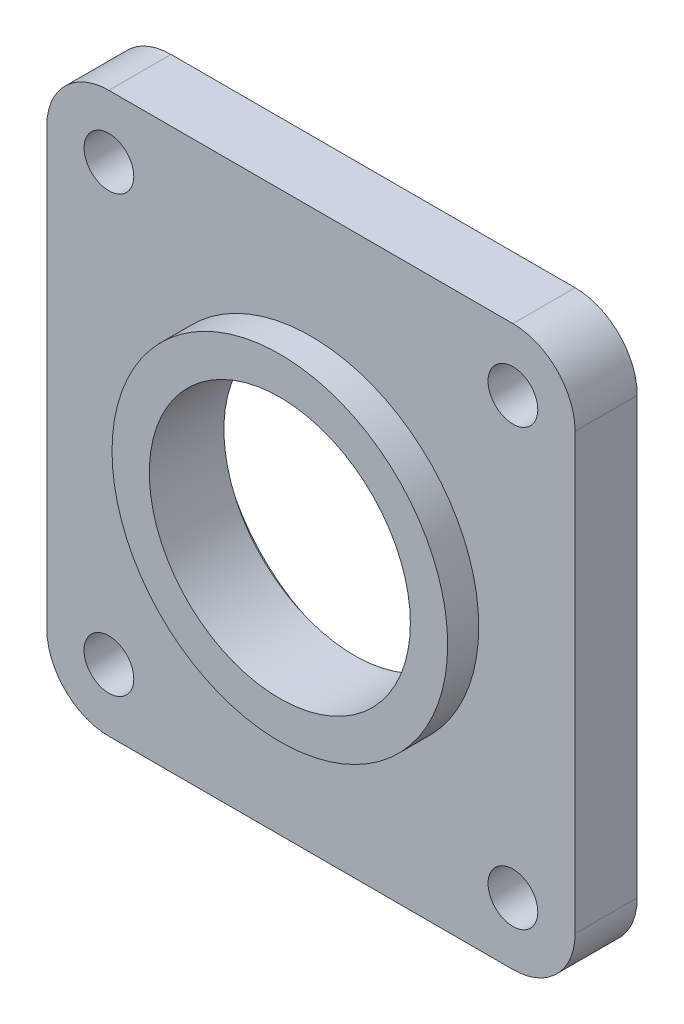
ISO-10303-21;
HEADER;
FILE_DESCRIPTION(('STEP AP214'),'2;1');
FILE_NAME('part.step','',(''),(''),'','','');
FILE_SCHEMA(('AUTOMOTIVE_DESIGN { 1 0 10303 214 1 1 1 1 }'));
ENDSEC;
DATA;
#1=APPLICATION_CONTEXT('core data for automotive mechanical design processes');
#2=APPLICATION_PROTOCOL_DEFINITION('international standard','automotive_design',2000,#1);
#3=PRODUCT_CONTEXT('',#1,'mechanical');
#4=PRODUCT('Part','Part','',(#3));
#5=PRODUCT_RELATED_PRODUCT_CATEGORY('part','',(#4));
#6=PRODUCT_DEFINITION_FORMATION('','',#4);
#7=PRODUCT_DEFINITION_CONTEXT('part definition',#1,'design');
#8=PRODUCT_DEFINITION('design','',#6,#7);
#9=PRODUCT_DEFINITION_SHAPE('','',#8);
#10=(LENGTH_UNIT() NAMED_UNIT(*) SI_UNIT(.MILLI.,.METRE.));
#11=(NAMED_UNIT(*) PLANE_ANGLE_UNIT() SI_UNIT($,.RADIAN.));
#12=(NAMED_UNIT(*) SI_UNIT($,.STERADIAN.) SOLID_ANGLE_UNIT());
#13=UNCERTAINTY_MEASURE_WITH_UNIT(LENGTH_MEASURE(1.E-05),#10,'distance_accuracy_value','');
#14=(GEOMETRIC_REPRESENTATION_CONTEXT(3) GLOBAL_UNCERTAINTY_ASSIGNED_CONTEXT((#13)) GLOBAL_UNIT_ASSIGNED_CONTEXT((#10,
#11,#12)) REPRESENTATION_CONTEXT('',''));
#15=CARTESIAN_POINT('',(0.,0.,0.));
#16=DIRECTION('',(0.,0.,1.));
#17=DIRECTION('',(1.,0.,0.));
#18=AXIS2_PLACEMENT_3D('',#15,#16,#17);
#19=CARTESIAN_POINT('',(0.,0.,10.));
#20=DIRECTION('',(0.,0.,1.));
#21=DIRECTION('',(1.,0.,0.));
#22=AXIS2_PLACEMENT_3D('',#19,#20,#21);
#23=PLANE('',#22);
#24=CARTESIAN_POINT('',(32.5,-35.,10.));
#25=DIRECTION('',(0.,0.,1.));
#26=DIRECTION('',(1.,0.,0.));
#27=AXIS2_PLACEMENT_3D('',#24,#25,#26);
#28=CIRCLE('',#27,4.);
#29=CARTESIAN_POINT('',(36.5,-35.,10.));
#30=VERTEX_POINT('',#29);
#31=EDGE_CURVE('E195',#30,#30,#28,.T.);
#32=ORIENTED_EDGE('',*,*,#31,.F.);
#33=EDGE_LOOP('',(#32));
#34=FACE_BOUND('',#33,.T.);
#35=CARTESIAN_POINT('',(-32.5,-35.,10.));
#36=DIRECTION('',(0.,0.,1.));
#37=DIRECTION('',(1.,0.,0.));
#38=AXIS2_PLACEMENT_3D('',#35,#36,#37);
#39=CIRCLE('',#38,4.00000000000001);
#40=CARTESIAN_POINT('',(-28.5,-35.,10.));
#41=VERTEX_POINT('',#40);
#42=EDGE_CURVE('E198',#41,#41,#39,.T.);
#43=ORIENTED_EDGE('',*,*,#42,.F.);
#44=EDGE_LOOP('',(#43));
#45=FACE_BOUND('',#44,.T.);
#46=CARTESIAN_POINT('',(-32.5,35.,10.));
#47=DIRECTION('',(0.,0.,1.));
#48=DIRECTION('',(1.,0.,0.));
#49=AXIS2_PLACEMENT_3D('',#46,#47,#48);
#50=CIRCLE('',#49,4.00000000000001);
#51=CARTESIAN_POINT('',(-28.5,35.,10.));
#52=VERTEX_POINT('',#51);
#53=EDGE_CURVE('E201',#52,#52,#50,.T.);
#54=ORIENTED_EDGE('',*,*,#53,.F.);
#55=EDGE_LOOP('',(#54));
#56=FACE_BOUND('',#55,.T.);
#57=CARTESIAN_POINT('',(32.5,35.,10.));
#58=DIRECTION('',(0.,0.,1.));
#59=DIRECTION('',(1.,0.,0.));
#60=AXIS2_PLACEMENT_3D('',#57,#58,#59);
#61=CIRCLE('',#60,4.);
#62=CARTESIAN_POINT('',(36.5,35.,10.));
#63=VERTEX_POINT('',#62);
#64=EDGE_CURVE('E204',#63,#63,#61,.T.);
#65=ORIENTED_EDGE('',*,*,#64,.F.);
#66=EDGE_LOOP('',(#65));
#67=FACE_BOUND('',#66,.T.);
#68=DIRECTION('',(0.,1.,0.));
#69=VECTOR('',#68,1.);
#70=CARTESIAN_POINT('',(42.5,45.,10.));
#71=LINE('',#70,#69);
#72=CARTESIAN_POINT('',(42.5,-35.,10.));
#73=VERTEX_POINT('',#72);
#74=CARTESIAN_POINT('',(42.5,35.,10.));
#75=VERTEX_POINT('',#74);
#76=EDGE_CURVE('E138',#73,#75,#71,.T.);
#77=ORIENTED_EDGE('',*,*,#76,.T.);
#78=CARTESIAN_POINT('',(32.5,35.,10.));
#79=DIRECTION('',(0.,0.,1.));
#80=DIRECTION('',(1.,0.,0.));
#81=AXIS2_PLACEMENT_3D('',#78,#79,#80);
#82=CIRCLE('',#81,10.);
#83=CARTESIAN_POINT('',(32.5,45.,10.));
#84=VERTEX_POINT('',#83);
#85=EDGE_CURVE('E153',#75,#84,#82,.T.);
#86=ORIENTED_EDGE('',*,*,#85,.T.);
#87=DIRECTION('',(-1.,0.,0.));
#88=VECTOR('',#87,1.);
#89=CARTESIAN_POINT('',(-42.5,45.,10.));
#90=LINE('',#89,#88);
#91=CARTESIAN_POINT('',(-32.5,45.,10.));
#92=VERTEX_POINT('',#91);
#93=EDGE_CURVE('E121',#84,#92,#90,.T.);
#94=ORIENTED_EDGE('',*,*,#93,.T.);
#95=CARTESIAN_POINT('',(-32.5,35.,10.));
#96=DIRECTION('',(0.,0.,1.));
#97=DIRECTION('',(1.,0.,0.));
#98=AXIS2_PLACEMENT_3D('',#95,#96,#97);
#99=CIRCLE('',#98,10.);
#100=CARTESIAN_POINT('',(-42.5,35.,10.));
#101=VERTEX_POINT('',#100);
#102=EDGE_CURVE('E151',#92,#101,#99,.T.);
#103=ORIENTED_EDGE('',*,*,#102,.T.);
#104=DIRECTION('',(0.,-1.,0.));
#105=VECTOR('',#104,1.);
#106=CARTESIAN_POINT('',(-42.5,45.,10.));
#107=LINE('',#106,#105);
#108=CARTESIAN_POINT('',(-42.5,-35.,10.));
#109=VERTEX_POINT('',#108);
#110=EDGE_CURVE('E164',#101,#109,#107,.T.);
#111=ORIENTED_EDGE('',*,*,#110,.T.);
#112=CARTESIAN_POINT('',(-32.5,-35.,10.));
#113=DIRECTION('',(0.,0.,1.));
#114=DIRECTION('',(1.,0.,0.));
#115=AXIS2_PLACEMENT_3D('',#112,#113,#114);
#116=CIRCLE('',#115,10.);
#117=CARTESIAN_POINT('',(-32.5,-45.,10.));
#118=VERTEX_POINT('',#117);
#119=EDGE_CURVE('E56',#109,#118,#116,.T.);
#120=ORIENTED_EDGE('',*,*,#119,.T.);
#121=DIRECTION('',(1.,0.,0.));
#122=VECTOR('',#121,1.);
#123=CARTESIAN_POINT('',(-42.5,-45.,10.));
#124=LINE('',#123,#122);
#125=CARTESIAN_POINT('',(32.5,-45.,10.));
#126=VERTEX_POINT('',#125);
#127=EDGE_CURVE('E139',#118,#126,#124,.T.);
#128=ORIENTED_EDGE('',*,*,#127,.T.);
#129=CARTESIAN_POINT('',(32.5,-35.,10.));
#130=DIRECTION('',(0.,0.,1.));
#131=DIRECTION('',(1.,0.,0.));
#132=AXIS2_PLACEMENT_3D('',#129,#130,#131);
#133=CIRCLE('',#132,10.);
#134=EDGE_CURVE('E148',#126,#73,#133,.T.);
#135=ORIENTED_EDGE('',*,*,#134,.T.);
#136=EDGE_LOOP('',(#77,#86,#94,#103,#111,#120,#128,#135));
#137=FACE_BOUND('',#136,.T.);
#138=CARTESIAN_POINT('',(0.,0.,10.));
#139=DIRECTION('',(0.,0.,1.));
#140=DIRECTION('',(1.,0.,0.));
#141=AXIS2_PLACEMENT_3D('',#138,#139,#140);
#142=CIRCLE('',#141,27.);
#143=CARTESIAN_POINT('',(27.,0.,10.));
#144=VERTEX_POINT('',#143);
#145=EDGE_CURVE('E187',#144,#144,#142,.T.);
#146=ORIENTED_EDGE('',*,*,#145,.F.);
#147=EDGE_LOOP('',(#146));
#148=FACE_BOUND('',#147,.T.);
#149=ADVANCED_FACE('F35',(#34,#45,#56,#67,#137,#148),#23,.T.);
#150=CARTESIAN_POINT('',(42.5,45.,10.));
#151=DIRECTION('',(-1.,0.,0.));
#152=DIRECTION('',(0.,-1.,0.));
#153=AXIS2_PLACEMENT_3D('',#150,#151,#152);
#154=PLANE('',#153);
#155=DIRECTION('',(0.,1.,0.));
#156=VECTOR('',#155,1.);
#157=CARTESIAN_POINT('',(42.5,45.,0.));
#158=LINE('',#157,#156);
#159=CARTESIAN_POINT('',(42.5,-35.,0.));
#160=VERTEX_POINT('',#159);
#161=CARTESIAN_POINT('',(42.5,35.,0.));
#162=VERTEX_POINT('',#161);
#163=EDGE_CURVE('E128',#160,#162,#158,.T.);
#164=ORIENTED_EDGE('',*,*,#163,.T.);
#165=DIRECTION('',(0.,0.,-1.));
#166=VECTOR('',#165,1.);
#167=CARTESIAN_POINT('',(42.5,35.,10.));
#168=LINE('',#167,#166);
#169=EDGE_CURVE('E106',#162,#75,#168,.F.);
#170=ORIENTED_EDGE('',*,*,#169,.T.);
#171=ORIENTED_EDGE('',*,*,#76,.F.);
#172=DIRECTION('',(0.,0.,-1.));
#173=VECTOR('',#172,1.);
#174=CARTESIAN_POINT('',(42.5,-35.,10.));
#175=LINE('',#174,#173);
#176=EDGE_CURVE('E111',#73,#160,#175,.T.);
#177=ORIENTED_EDGE('',*,*,#176,.T.);
#178=EDGE_LOOP('',(#164,#170,#171,#177));
#179=FACE_BOUND('',#178,.T.);
#180=ADVANCED_FACE('F260',(#179),#154,.F.);
#181=CARTESIAN_POINT('',(-42.5,45.,10.));
#182=DIRECTION('',(0.,-1.,0.));
#183=DIRECTION('',(0.,0.,-1.));
#184=AXIS2_PLACEMENT_3D('',#181,#182,#183);
#185=PLANE('',#184);
#186=ORIENTED_EDGE('',*,*,#93,.F.);
#187=DIRECTION('',(0.,0.,-1.));
#188=VECTOR('',#187,1.);
#189=CARTESIAN_POINT('',(32.5,45.,10.));
#190=LINE('',#189,#188);
#191=CARTESIAN_POINT('',(32.5,45.,0.));
#192=VERTEX_POINT('',#191);
#193=EDGE_CURVE('E105',#84,#192,#190,.T.);
#194=ORIENTED_EDGE('',*,*,#193,.T.);
#195=DIRECTION('',(-1.,0.,0.));
#196=VECTOR('',#195,1.);
#197=CARTESIAN_POINT('',(-42.5,45.,0.));
#198=LINE('',#197,#196);
#199=CARTESIAN_POINT('',(-32.5,45.,0.));
#200=VERTEX_POINT('',#199);
#201=EDGE_CURVE('E118',#192,#200,#198,.T.);
#202=ORIENTED_EDGE('',*,*,#201,.T.);
#203=DIRECTION('',(0.,0.,-1.));
#204=VECTOR('',#203,1.);
#205=CARTESIAN_POINT('',(-32.5,45.,10.));
#206=LINE('',#205,#204);
#207=EDGE_CURVE('E123',#200,#92,#206,.F.);
#208=ORIENTED_EDGE('',*,*,#207,.T.);
#209=EDGE_LOOP('',(#186,#194,#202,#208));
#210=FACE_BOUND('',#209,.T.);
#211=ADVANCED_FACE('F117',(#210),#185,.F.);
#212=CARTESIAN_POINT('',(-42.5,45.,10.));
#213=DIRECTION('',(1.,0.,0.));
#214=DIRECTION('',(0.,1.,0.));
#215=AXIS2_PLACEMENT_3D('',#212,#213,#214);
#216=PLANE('',#215);
#217=ORIENTED_EDGE('',*,*,#110,.F.);
#218=DIRECTION('',(0.,0.,-1.));
#219=VECTOR('',#218,1.);
#220=CARTESIAN_POINT('',(-42.5,35.,10.));
#221=LINE('',#220,#219);
#222=CARTESIAN_POINT('',(-42.5,35.,0.));
#223=VERTEX_POINT('',#222);
#224=EDGE_CURVE('E157',#101,#223,#221,.T.);
#225=ORIENTED_EDGE('',*,*,#224,.T.);
#226=DIRECTION('',(0.,-1.,0.));
#227=VECTOR('',#226,1.);
#228=CARTESIAN_POINT('',(-42.5,45.,0.));
#229=LINE('',#228,#227);
#230=CARTESIAN_POINT('',(-42.5,-35.,0.));
#231=VERTEX_POINT('',#230);
#232=EDGE_CURVE('E127',#223,#231,#229,.T.);
#233=ORIENTED_EDGE('',*,*,#232,.T.);
#234=DIRECTION('',(0.,0.,-1.));
#235=VECTOR('',#234,1.);
#236=CARTESIAN_POINT('',(-42.5,-35.,10.));
#237=LINE('',#236,#235);
#238=EDGE_CURVE('E155',#231,#109,#237,.F.);
#239=ORIENTED_EDGE('',*,*,#238,.T.);
#240=EDGE_LOOP('',(#217,#225,#233,#239));
#241=FACE_BOUND('',#240,.T.);
#242=ADVANCED_FACE('F162',(#241),#216,.F.);
#243=CARTESIAN_POINT('',(-42.5,-45.,10.));
#244=DIRECTION('',(0.,1.,0.));
#245=DIRECTION('',(0.,0.,1.));
#246=AXIS2_PLACEMENT_3D('',#243,#244,#245);
#247=PLANE('',#246);
#248=ORIENTED_EDGE('',*,*,#127,.F.);
#249=DIRECTION('',(0.,0.,-1.));
#250=VECTOR('',#249,1.);
#251=CARTESIAN_POINT('',(-32.5,-45.,10.));
#252=LINE('',#251,#250);
#253=CARTESIAN_POINT('',(-32.5,-45.,0.));
#254=VERTEX_POINT('',#253);
#255=EDGE_CURVE('E11',#118,#254,#252,.T.);
#256=ORIENTED_EDGE('',*,*,#255,.T.);
#257=DIRECTION('',(1.,0.,0.));
#258=VECTOR('',#257,1.);
#259=CARTESIAN_POINT('',(-42.5,-45.,0.));
#260=LINE('',#259,#258);
#261=CARTESIAN_POINT('',(32.5,-45.,0.));
#262=VERTEX_POINT('',#261);
#263=EDGE_CURVE('E131',#254,#262,#260,.T.);
#264=ORIENTED_EDGE('',*,*,#263,.T.);
#265=DIRECTION('',(0.,0.,-1.));
#266=VECTOR('',#265,1.);
#267=CARTESIAN_POINT('',(32.5,-45.,10.));
#268=LINE('',#267,#266);
#269=EDGE_CURVE('E43',#262,#126,#268,.F.);
#270=ORIENTED_EDGE('',*,*,#269,.T.);
#271=EDGE_LOOP('',(#248,#256,#264,#270));
#272=FACE_BOUND('',#271,.T.);
#273=ADVANCED_FACE('F171',(#272),#247,.F.);
#274=CARTESIAN_POINT('',(0.,0.,0.));
#275=DIRECTION('',(0.,0.,1.));
#276=DIRECTION('',(1.,0.,0.));
#277=AXIS2_PLACEMENT_3D('',#274,#275,#276);
#278=PLANE('',#277);
#279=CARTESIAN_POINT('',(32.5,-35.,0.));
#280=DIRECTION('',(0.,0.,-1.));
#281=DIRECTION('',(-1.,0.,0.));
#282=AXIS2_PLACEMENT_3D('',#279,#280,#281);
#283=CIRCLE('',#282,4.);
#284=CARTESIAN_POINT('',(28.5,-35.,0.));
#285=VERTEX_POINT('',#284);
#286=EDGE_CURVE('E211',#285,#285,#283,.T.);
#287=ORIENTED_EDGE('',*,*,#286,.F.);
#288=EDGE_LOOP('',(#287));
#289=FACE_BOUND('',#288,.T.);
#290=CARTESIAN_POINT('',(-32.5,-35.,0.));
#291=DIRECTION('',(0.,0.,-1.));
#292=DIRECTION('',(-1.,0.,0.));
#293=AXIS2_PLACEMENT_3D('',#290,#291,#292);
#294=CIRCLE('',#293,4.00000000000001);
#295=CARTESIAN_POINT('',(-36.5,-35.,0.));
#296=VERTEX_POINT('',#295);
#297=EDGE_CURVE('E214',#296,#296,#294,.T.);
#298=ORIENTED_EDGE('',*,*,#297,.F.);
#299=EDGE_LOOP('',(#298));
#300=FACE_BOUND('',#299,.T.);
#301=CARTESIAN_POINT('',(-32.5,35.,0.));
#302=DIRECTION('',(0.,0.,-1.));
#303=DIRECTION('',(-1.,0.,0.));
#304=AXIS2_PLACEMENT_3D('',#301,#302,#303);
#305=CIRCLE('',#304,4.00000000000001);
#306=CARTESIAN_POINT('',(-36.5,35.,0.));
#307=VERTEX_POINT('',#306);
#308=EDGE_CURVE('E210',#307,#307,#305,.T.);
#309=ORIENTED_EDGE('',*,*,#308,.F.);
#310=EDGE_LOOP('',(#309));
#311=FACE_BOUND('',#310,.T.);
#312=CARTESIAN_POINT('',(32.5,35.,0.));
#313=DIRECTION('',(0.,0.,-1.));
#314=DIRECTION('',(-1.,0.,0.));
#315=AXIS2_PLACEMENT_3D('',#312,#313,#314);
#316=CIRCLE('',#315,4.);
#317=CARTESIAN_POINT('',(28.5,35.,0.));
#318=VERTEX_POINT('',#317);
#319=EDGE_CURVE('E207',#318,#318,#316,.T.);
#320=ORIENTED_EDGE('',*,*,#319,.F.);
#321=EDGE_LOOP('',(#320));
#322=FACE_BOUND('',#321,.T.);
#323=CARTESIAN_POINT('',(0.,0.,0.));
#324=DIRECTION('',(0.,0.,1.));
#325=DIRECTION('',(1.,0.,0.));
#326=AXIS2_PLACEMENT_3D('',#323,#324,#325);
#327=CIRCLE('',#326,25.);
#328=CARTESIAN_POINT('',(25.,0.,0.));
#329=VERTEX_POINT('',#328);
#330=EDGE_CURVE('E133',#329,#329,#327,.T.);
#331=ORIENTED_EDGE('',*,*,#330,.T.);
#332=EDGE_LOOP('',(#331));
#333=FACE_BOUND('',#332,.T.);
#334=ORIENTED_EDGE('',*,*,#201,.F.);
#335=CARTESIAN_POINT('',(32.5,35.,0.));
#336=DIRECTION('',(0.,0.,1.));
#337=DIRECTION('',(1.,0.,0.));
#338=AXIS2_PLACEMENT_3D('',#335,#336,#337);
#339=CIRCLE('',#338,10.);
#340=EDGE_CURVE('E101',#192,#162,#339,.F.);
#341=ORIENTED_EDGE('',*,*,#340,.T.);
#342=ORIENTED_EDGE('',*,*,#163,.F.);
#343=CARTESIAN_POINT('',(32.5,-35.,0.));
#344=DIRECTION('',(0.,0.,1.));
#345=DIRECTION('',(1.,0.,0.));
#346=AXIS2_PLACEMENT_3D('',#343,#344,#345);
#347=CIRCLE('',#346,10.);
#348=EDGE_CURVE('E122',#160,#262,#347,.F.);
#349=ORIENTED_EDGE('',*,*,#348,.T.);
#350=ORIENTED_EDGE('',*,*,#263,.F.);
#351=CARTESIAN_POINT('',(-32.5,-35.,0.));
#352=DIRECTION('',(0.,0.,1.));
#353=DIRECTION('',(1.,0.,0.));
#354=AXIS2_PLACEMENT_3D('',#351,#352,#353);
#355=CIRCLE('',#354,10.);
#356=EDGE_CURVE('E142',#254,#231,#355,.F.);
#357=ORIENTED_EDGE('',*,*,#356,.T.);
#358=ORIENTED_EDGE('',*,*,#232,.F.);
#359=CARTESIAN_POINT('',(-32.5,35.,0.));
#360=DIRECTION('',(0.,0.,1.));
#361=DIRECTION('',(1.,0.,0.));
#362=AXIS2_PLACEMENT_3D('',#359,#360,#361);
#363=CIRCLE('',#362,10.);
#364=EDGE_CURVE('E112',#223,#200,#363,.F.);
#365=ORIENTED_EDGE('',*,*,#364,.T.);
#366=EDGE_LOOP('',(#334,#341,#342,#349,#350,#357,#358,#365));
#367=FACE_BOUND('',#366,.T.);
#368=ADVANCED_FACE('F125',(#289,#300,#311,#322,#333,#367),#278,.F.);
#369=CARTESIAN_POINT('',(0.,0.,0.));
#370=DIRECTION('',(0.,0.,1.));
#371=DIRECTION('',(1.,0.,0.));
#372=AXIS2_PLACEMENT_3D('',#369,#370,#371);
#373=CYLINDRICAL_SURFACE('',#372,25.);
#374=ORIENTED_EDGE('',*,*,#330,.F.);
#375=EDGE_LOOP('',(#374));
#376=FACE_BOUND('',#375,.T.);
#377=CARTESIAN_POINT('',(0.,0.,3.));
#378=DIRECTION('',(0.,0.,1.));
#379=DIRECTION('',(1.,0.,0.));
#380=AXIS2_PLACEMENT_3D('',#377,#378,#379);
#381=CIRCLE('',#380,25.);
#382=CARTESIAN_POINT('',(25.,0.,3.));
#383=VERTEX_POINT('',#382);
#384=EDGE_CURVE('E180',#383,#383,#381,.T.);
#385=ORIENTED_EDGE('',*,*,#384,.T.);
#386=EDGE_LOOP('',(#385));
#387=FACE_BOUND('',#386,.T.);
#388=ADVANCED_FACE('F224',(#376,#387),#373,.F.);
#389=CARTESIAN_POINT('',(25.,0.,3.));
#390=DIRECTION('',(0.,0.,1.));
#391=DIRECTION('',(1.,0.,0.));
#392=AXIS2_PLACEMENT_3D('',#389,#390,#391);
#393=PLANE('',#392);
#394=ORIENTED_EDGE('',*,*,#384,.F.);
#395=EDGE_LOOP('',(#394));
#396=FACE_BOUND('',#395,.T.);
#397=CARTESIAN_POINT('',(0.,0.,3.));
#398=DIRECTION('',(0.,0.,1.));
#399=DIRECTION('',(1.,0.,0.));
#400=AXIS2_PLACEMENT_3D('',#397,#398,#399);
#401=CIRCLE('',#400,21.);
#402=CARTESIAN_POINT('',(21.,0.,3.));
#403=VERTEX_POINT('',#402);
#404=EDGE_CURVE('E183',#403,#403,#401,.T.);
#405=ORIENTED_EDGE('',*,*,#404,.T.);
#406=EDGE_LOOP('',(#405));
#407=FACE_BOUND('',#406,.T.);
#408=ADVANCED_FACE('F233',(#396,#407),#393,.F.);
#409=CARTESIAN_POINT('',(0.,0.,0.));
#410=DIRECTION('',(0.,0.,1.));
#411=DIRECTION('',(1.,0.,0.));
#412=AXIS2_PLACEMENT_3D('',#409,#410,#411);
#413=CYLINDRICAL_SURFACE('',#412,21.);
#414=ORIENTED_EDGE('',*,*,#404,.F.);
#415=EDGE_LOOP('',(#414));
#416=FACE_BOUND('',#415,.T.);
#417=CARTESIAN_POINT('',(0.,0.,15.));
#418=DIRECTION('',(0.,0.,1.));
#419=DIRECTION('',(1.,0.,0.));
#420=AXIS2_PLACEMENT_3D('',#417,#418,#419);
#421=CIRCLE('',#420,21.);
#422=CARTESIAN_POINT('',(21.,0.,15.));
#423=VERTEX_POINT('',#422);
#424=EDGE_CURVE('E190',#423,#423,#421,.T.);
#425=ORIENTED_EDGE('',*,*,#424,.T.);
#426=EDGE_LOOP('',(#425));
#427=FACE_BOUND('',#426,.T.);
#428=ADVANCED_FACE('F239',(#416,#427),#413,.F.);
#429=CARTESIAN_POINT('',(0.,0.,15.));
#430=DIRECTION('',(0.,0.,1.));
#431=DIRECTION('',(1.,0.,0.));
#432=AXIS2_PLACEMENT_3D('',#429,#430,#431);
#433=PLANE('',#432);
#434=CARTESIAN_POINT('',(0.,0.,15.));
#435=DIRECTION('',(0.,0.,1.));
#436=DIRECTION('',(1.,0.,0.));
#437=AXIS2_PLACEMENT_3D('',#434,#435,#436);
#438=CIRCLE('',#437,27.);
#439=CARTESIAN_POINT('',(27.,0.,15.));
#440=VERTEX_POINT('',#439);
#441=EDGE_CURVE('E186',#440,#440,#438,.T.);
#442=ORIENTED_EDGE('',*,*,#441,.T.);
#443=EDGE_LOOP('',(#442));
#444=FACE_BOUND('',#443,.T.);
#445=ORIENTED_EDGE('',*,*,#424,.F.);
#446=EDGE_LOOP('',(#445));
#447=FACE_BOUND('',#446,.T.);
#448=ADVANCED_FACE('F245',(#444,#447),#433,.T.);
#449=CARTESIAN_POINT('',(0.,0.,15.));
#450=DIRECTION('',(0.,0.,-1.));
#451=DIRECTION('',(-1.,0.,0.));
#452=AXIS2_PLACEMENT_3D('',#449,#450,#451);
#453=CYLINDRICAL_SURFACE('',#452,27.);
#454=ORIENTED_EDGE('',*,*,#441,.F.);
#455=EDGE_LOOP('',(#454));
#456=FACE_BOUND('',#455,.T.);
#457=ORIENTED_EDGE('',*,*,#145,.T.);
#458=EDGE_LOOP('',(#457));
#459=FACE_BOUND('',#458,.T.);
#460=ADVANCED_FACE('F250',(#456,#459),#453,.T.);
#461=CARTESIAN_POINT('',(32.5,35.,10.));
#462=DIRECTION('',(0.,0.,-1.));
#463=DIRECTION('',(-1.,0.,0.));
#464=AXIS2_PLACEMENT_3D('',#461,#462,#463);
#465=CYLINDRICAL_SURFACE('',#464,10.);
#466=ORIENTED_EDGE('',*,*,#85,.F.);
#467=ORIENTED_EDGE('',*,*,#169,.F.);
#468=ORIENTED_EDGE('',*,*,#340,.F.);
#469=ORIENTED_EDGE('',*,*,#193,.F.);
#470=EDGE_LOOP('',(#466,#467,#468,#469));
#471=FACE_BOUND('',#470,.T.);
#472=ADVANCED_FACE('F104',(#471),#465,.T.);
#473=CARTESIAN_POINT('',(-32.5,35.,10.));
#474=DIRECTION('',(0.,0.,-1.));
#475=DIRECTION('',(-1.,0.,0.));
#476=AXIS2_PLACEMENT_3D('',#473,#474,#475);
#477=CYLINDRICAL_SURFACE('',#476,10.);
#478=ORIENTED_EDGE('',*,*,#102,.F.);
#479=ORIENTED_EDGE('',*,*,#207,.F.);
#480=ORIENTED_EDGE('',*,*,#364,.F.);
#481=ORIENTED_EDGE('',*,*,#224,.F.);
#482=EDGE_LOOP('',(#478,#479,#480,#481));
#483=FACE_BOUND('',#482,.T.);
#484=ADVANCED_FACE('F279',(#483),#477,.T.);
#485=CARTESIAN_POINT('',(-32.5,-35.,10.));
#486=DIRECTION('',(0.,0.,-1.));
#487=DIRECTION('',(-1.,0.,0.));
#488=AXIS2_PLACEMENT_3D('',#485,#486,#487);
#489=CYLINDRICAL_SURFACE('',#488,10.);
#490=ORIENTED_EDGE('',*,*,#119,.F.);
#491=ORIENTED_EDGE('',*,*,#238,.F.);
#492=ORIENTED_EDGE('',*,*,#356,.F.);
#493=ORIENTED_EDGE('',*,*,#255,.F.);
#494=EDGE_LOOP('',(#490,#491,#492,#493));
#495=FACE_BOUND('',#494,.T.);
#496=ADVANCED_FACE('F170',(#495),#489,.T.);
#497=CARTESIAN_POINT('',(32.5,-35.,10.));
#498=DIRECTION('',(0.,0.,-1.));
#499=DIRECTION('',(-1.,0.,0.));
#500=AXIS2_PLACEMENT_3D('',#497,#498,#499);
#501=CYLINDRICAL_SURFACE('',#500,10.);
#502=ORIENTED_EDGE('',*,*,#134,.F.);
#503=ORIENTED_EDGE('',*,*,#269,.F.);
#504=ORIENTED_EDGE('',*,*,#348,.F.);
#505=ORIENTED_EDGE('',*,*,#176,.F.);
#506=EDGE_LOOP('',(#502,#503,#504,#505));
#507=FACE_BOUND('',#506,.T.);
#508=ADVANCED_FACE('F37',(#507),#501,.T.);
#509=CARTESIAN_POINT('',(32.5,35.,15.));
#510=DIRECTION('',(0.,0.,-1.));
#511=DIRECTION('',(-1.,0.,0.));
#512=AXIS2_PLACEMENT_3D('',#509,#510,#511);
#513=CYLINDRICAL_SURFACE('',#512,4.);
#514=ORIENTED_EDGE('',*,*,#64,.T.);
#515=EDGE_LOOP('',(#514));
#516=FACE_BOUND('',#515,.T.);
#517=ORIENTED_EDGE('',*,*,#319,.T.);
#518=EDGE_LOOP('',(#517));
#519=FACE_BOUND('',#518,.T.);
#520=ADVANCED_FACE('F285',(#516,#519),#513,.F.);
#521=CARTESIAN_POINT('',(-32.5,35.,15.));
#522=DIRECTION('',(0.,0.,-1.));
#523=DIRECTION('',(-1.,0.,0.));
#524=AXIS2_PLACEMENT_3D('',#521,#522,#523);
#525=CYLINDRICAL_SURFACE('',#524,4.00000000000001);
#526=ORIENTED_EDGE('',*,*,#53,.T.);
#527=EDGE_LOOP('',(#526));
#528=FACE_BOUND('',#527,.T.);
#529=ORIENTED_EDGE('',*,*,#308,.T.);
#530=EDGE_LOOP('',(#529));
#531=FACE_BOUND('',#530,.T.);
#532=ADVANCED_FACE('F220',(#528,#531),#525,.F.);
#533=CARTESIAN_POINT('',(-32.5,-35.,15.));
#534=DIRECTION('',(0.,0.,-1.));
#535=DIRECTION('',(-1.,0.,0.));
#536=AXIS2_PLACEMENT_3D('',#533,#534,#535);
#537=CYLINDRICAL_SURFACE('',#536,4.00000000000001);
#538=ORIENTED_EDGE('',*,*,#42,.T.);
#539=EDGE_LOOP('',(#538));
#540=FACE_BOUND('',#539,.T.);
#541=ORIENTED_EDGE('',*,*,#297,.T.);
#542=EDGE_LOOP('',(#541));
#543=FACE_BOUND('',#542,.T.);
#544=ADVANCED_FACE('F299',(#540,#543),#537,.F.);
#545=CARTESIAN_POINT('',(32.5,-35.,15.));
#546=DIRECTION('',(0.,0.,-1.));
#547=DIRECTION('',(-1.,0.,0.));
#548=AXIS2_PLACEMENT_3D('',#545,#546,#547);
#549=CYLINDRICAL_SURFACE('',#548,4.);
#550=ORIENTED_EDGE('',*,*,#31,.T.);
#551=EDGE_LOOP('',(#550));
#552=FACE_BOUND('',#551,.T.);
#553=ORIENTED_EDGE('',*,*,#286,.T.);
#554=EDGE_LOOP('',(#553));
#555=FACE_BOUND('',#554,.T.);
#556=ADVANCED_FACE('F304',(#552,#555),#549,.F.);
#557=CLOSED_SHELL('',(#149,#180,#211,#242,#273,#368,#388,#408,#428,#448,#460,#472,#484,#496,
#508,#520,#532,#544,#556));
#558=MANIFOLD_SOLID_BREP('B2',#557);
#559=ADVANCED_BREP_SHAPE_REPRESENTATION('',(#18,#558),#14);
#560=SHAPE_DEFINITION_REPRESENTATION(#9,#559);
ENDSEC;
END-ISO-10303-21;
